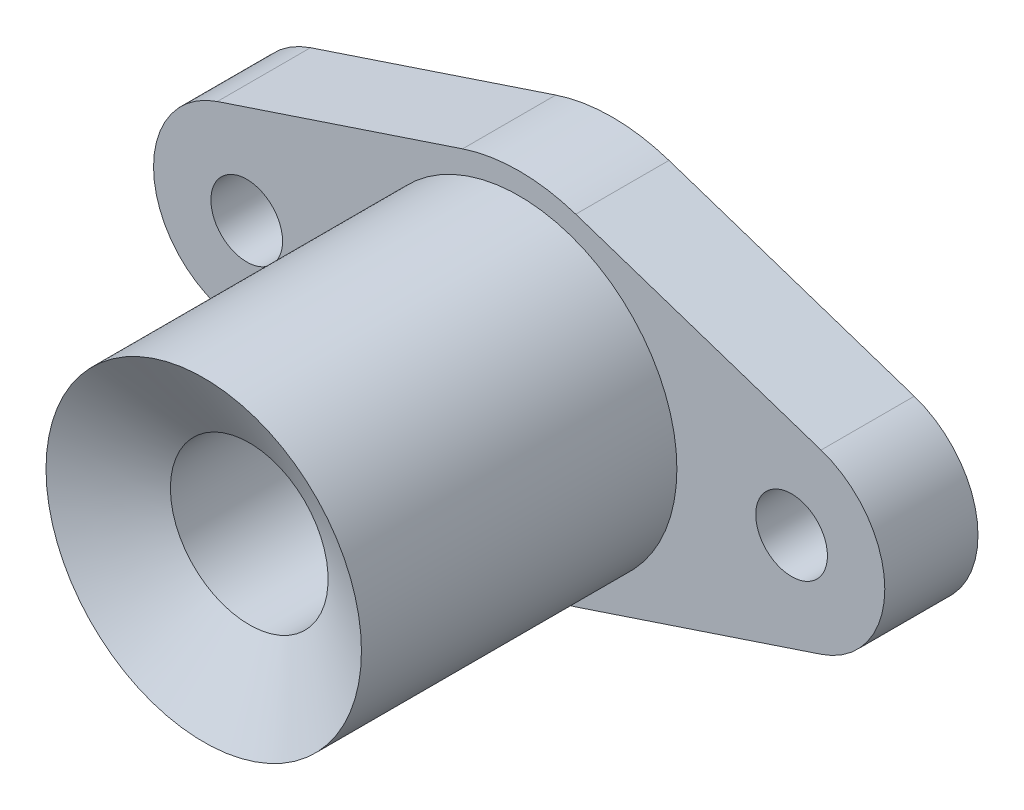
ISO-10303-21;
HEADER;
FILE_DESCRIPTION(('STEP AP214'),'2;1');
FILE_NAME('part.step','',(''),(''),'','','');
FILE_SCHEMA(('AUTOMOTIVE_DESIGN { 1 0 10303 214 1 1 1 1 }'));
ENDSEC;
DATA;
#1=APPLICATION_CONTEXT('core data for automotive mechanical design processes');
#2=APPLICATION_PROTOCOL_DEFINITION('international standard','automotive_design',2000,#1);
#3=PRODUCT_CONTEXT('',#1,'mechanical');
#4=PRODUCT('Part','Part','',(#3));
#5=PRODUCT_RELATED_PRODUCT_CATEGORY('part','',(#4));
#6=PRODUCT_DEFINITION_FORMATION('','',#4);
#7=PRODUCT_DEFINITION_CONTEXT('part definition',#1,'design');
#8=PRODUCT_DEFINITION('design','',#6,#7);
#9=PRODUCT_DEFINITION_SHAPE('','',#8);
#10=(LENGTH_UNIT() NAMED_UNIT(*) SI_UNIT(.MILLI.,.METRE.));
#11=(NAMED_UNIT(*) PLANE_ANGLE_UNIT() SI_UNIT($,.RADIAN.));
#12=(NAMED_UNIT(*) SI_UNIT($,.STERADIAN.) SOLID_ANGLE_UNIT());
#13=UNCERTAINTY_MEASURE_WITH_UNIT(LENGTH_MEASURE(1.E-05),#10,'distance_accuracy_value','');
#14=(GEOMETRIC_REPRESENTATION_CONTEXT(3) GLOBAL_UNCERTAINTY_ASSIGNED_CONTEXT((#13)) GLOBAL_UNIT_ASSIGNED_CONTEXT((#10,
#11,#12)) REPRESENTATION_CONTEXT('',''));
#15=CARTESIAN_POINT('',(0.,0.,0.));
#16=DIRECTION('',(0.,0.,1.));
#17=DIRECTION('',(1.,0.,0.));
#18=AXIS2_PLACEMENT_3D('',#15,#16,#17);
#19=CARTESIAN_POINT('',(-38.,0.,-13.));
#20=DIRECTION('',(0.,0.,1.));
#21=DIRECTION('',(1.,0.,0.));
#22=AXIS2_PLACEMENT_3D('',#19,#20,#21);
#23=CYLINDRICAL_SURFACE('',#22,13.);
#24=CARTESIAN_POINT('',(-38.,0.,0.));
#25=DIRECTION('',(0.,0.,1.));
#26=DIRECTION('',(1.,0.,0.));
#27=AXIS2_PLACEMENT_3D('',#24,#25,#26);
#28=CIRCLE('',#27,13.);
#29=CARTESIAN_POINT('',(-42.1052631578947,12.3347806792189,0.));
#30=VERTEX_POINT('',#29);
#31=CARTESIAN_POINT('',(-42.1052631578947,-12.3347806792189,0.));
#32=VERTEX_POINT('',#31);
#33=EDGE_CURVE('E130',#30,#32,#28,.T.);
#34=ORIENTED_EDGE('',*,*,#33,.F.);
#35=DIRECTION('',(0.,0.,1.));
#36=VECTOR('',#35,1.);
#37=CARTESIAN_POINT('',(-42.1052631578947,12.3347806792189,-13.));
#38=LINE('',#37,#36);
#39=CARTESIAN_POINT('',(-42.1052631578947,12.3347806792189,-13.));
#40=VERTEX_POINT('',#39);
#41=EDGE_CURVE('E11',#40,#30,#38,.T.);
#42=ORIENTED_EDGE('',*,*,#41,.F.);
#43=CARTESIAN_POINT('',(-38.,0.,-13.));
#44=DIRECTION('',(0.,0.,1.));
#45=DIRECTION('',(1.,0.,0.));
#46=AXIS2_PLACEMENT_3D('',#43,#44,#45);
#47=CIRCLE('',#46,13.);
#48=CARTESIAN_POINT('',(-42.1052631578947,-12.3347806792189,-13.));
#49=VERTEX_POINT('',#48);
#50=EDGE_CURVE('E151',#40,#49,#47,.T.);
#51=ORIENTED_EDGE('',*,*,#50,.T.);
#52=DIRECTION('',(0.,0.,1.));
#53=VECTOR('',#52,1.);
#54=CARTESIAN_POINT('',(-42.1052631578947,-12.3347806792189,-13.));
#55=LINE('',#54,#53);
#56=EDGE_CURVE('E36',#49,#32,#55,.T.);
#57=ORIENTED_EDGE('',*,*,#56,.T.);
#58=EDGE_LOOP('',(#34,#42,#51,#57));
#59=FACE_BOUND('',#58,.T.);
#60=ADVANCED_FACE('F33',(#59),#23,.T.);
#61=CARTESIAN_POINT('',(-42.1052631578947,12.3347806792189,-13.));
#62=DIRECTION('',(-0.315789473684211,0.948829283016839,0.));
#63=DIRECTION('',(-0.948829283016839,-0.315789473684211,0.));
#64=AXIS2_PLACEMENT_3D('',#61,#62,#63);
#65=PLANE('',#64);
#66=DIRECTION('',(-0.948829283016839,-0.315789473684211,0.));
#67=VECTOR('',#66,1.);
#68=CARTESIAN_POINT('',(-42.1052631578947,12.3347806792189,0.));
#69=LINE('',#68,#67);
#70=CARTESIAN_POINT('',(-7.89473684210527,23.720732075421,0.));
#71=VERTEX_POINT('',#70);
#72=EDGE_CURVE('E149',#71,#30,#69,.T.);
#73=ORIENTED_EDGE('',*,*,#72,.F.);
#74=DIRECTION('',(0.,0.,1.));
#75=VECTOR('',#74,1.);
#76=CARTESIAN_POINT('',(-7.89473684210527,23.720732075421,-13.));
#77=LINE('',#76,#75);
#78=CARTESIAN_POINT('',(-7.89473684210527,23.720732075421,-13.));
#79=VERTEX_POINT('',#78);
#80=EDGE_CURVE('E42',#79,#71,#77,.T.);
#81=ORIENTED_EDGE('',*,*,#80,.F.);
#82=DIRECTION('',(-0.948829283016839,-0.315789473684211,0.));
#83=VECTOR('',#82,1.);
#84=CARTESIAN_POINT('',(-42.1052631578947,12.3347806792189,-13.));
#85=LINE('',#84,#83);
#86=EDGE_CURVE('E120',#79,#40,#85,.T.);
#87=ORIENTED_EDGE('',*,*,#86,.T.);
#88=ORIENTED_EDGE('',*,*,#41,.T.);
#89=EDGE_LOOP('',(#73,#81,#87,#88));
#90=FACE_BOUND('',#89,.T.);
#91=ADVANCED_FACE('F163',(#90),#65,.T.);
#92=CARTESIAN_POINT('',(0.,0.,-13.));
#93=DIRECTION('',(0.,0.,1.));
#94=DIRECTION('',(1.,0.,0.));
#95=AXIS2_PLACEMENT_3D('',#92,#93,#94);
#96=CYLINDRICAL_SURFACE('',#95,25.);
#97=CARTESIAN_POINT('',(0.,0.,0.));
#98=DIRECTION('',(0.,0.,1.));
#99=DIRECTION('',(1.,0.,0.));
#100=AXIS2_PLACEMENT_3D('',#97,#98,#99);
#101=CIRCLE('',#100,25.);
#102=CARTESIAN_POINT('',(7.89473684210527,23.720732075421,0.));
#103=VERTEX_POINT('',#102);
#104=EDGE_CURVE('E107',#103,#71,#101,.T.);
#105=ORIENTED_EDGE('',*,*,#104,.F.);
#106=DIRECTION('',(0.,0.,1.));
#107=VECTOR('',#106,1.);
#108=CARTESIAN_POINT('',(7.89473684210527,23.720732075421,-13.));
#109=LINE('',#108,#107);
#110=CARTESIAN_POINT('',(7.89473684210527,23.720732075421,-13.));
#111=VERTEX_POINT('',#110);
#112=EDGE_CURVE('E102',#111,#103,#109,.T.);
#113=ORIENTED_EDGE('',*,*,#112,.F.);
#114=CARTESIAN_POINT('',(0.,0.,-13.));
#115=DIRECTION('',(0.,0.,1.));
#116=DIRECTION('',(1.,0.,0.));
#117=AXIS2_PLACEMENT_3D('',#114,#115,#116);
#118=CIRCLE('',#117,25.);
#119=EDGE_CURVE('E105',#111,#79,#118,.T.);
#120=ORIENTED_EDGE('',*,*,#119,.T.);
#121=ORIENTED_EDGE('',*,*,#80,.T.);
#122=EDGE_LOOP('',(#105,#113,#120,#121));
#123=FACE_BOUND('',#122,.T.);
#124=ADVANCED_FACE('F104',(#123),#96,.T.);
#125=CARTESIAN_POINT('',(42.1052631578947,12.3347806792189,-13.));
#126=DIRECTION('',(0.315789473684211,0.948829283016839,0.));
#127=DIRECTION('',(-0.948829283016839,0.315789473684211,0.));
#128=AXIS2_PLACEMENT_3D('',#125,#126,#127);
#129=PLANE('',#128);
#130=DIRECTION('',(-0.948829283016839,0.315789473684211,0.));
#131=VECTOR('',#130,1.);
#132=CARTESIAN_POINT('',(42.1052631578947,12.3347806792189,0.));
#133=LINE('',#132,#131);
#134=CARTESIAN_POINT('',(42.1052631578947,12.3347806792189,0.));
#135=VERTEX_POINT('',#134);
#136=EDGE_CURVE('E146',#135,#103,#133,.T.);
#137=ORIENTED_EDGE('',*,*,#136,.F.);
#138=DIRECTION('',(0.,0.,1.));
#139=VECTOR('',#138,1.);
#140=CARTESIAN_POINT('',(42.1052631578947,12.3347806792189,-13.));
#141=LINE('',#140,#139);
#142=CARTESIAN_POINT('',(42.1052631578947,12.3347806792189,-13.));
#143=VERTEX_POINT('',#142);
#144=EDGE_CURVE('E112',#143,#135,#141,.T.);
#145=ORIENTED_EDGE('',*,*,#144,.F.);
#146=DIRECTION('',(-0.948829283016839,0.315789473684211,0.));
#147=VECTOR('',#146,1.);
#148=CARTESIAN_POINT('',(42.1052631578947,12.3347806792189,-13.));
#149=LINE('',#148,#147);
#150=EDGE_CURVE('E118',#143,#111,#149,.T.);
#151=ORIENTED_EDGE('',*,*,#150,.T.);
#152=ORIENTED_EDGE('',*,*,#112,.T.);
#153=EDGE_LOOP('',(#137,#145,#151,#152));
#154=FACE_BOUND('',#153,.T.);
#155=ADVANCED_FACE('F122',(#154),#129,.T.);
#156=CARTESIAN_POINT('',(38.,0.,-13.));
#157=DIRECTION('',(0.,0.,1.));
#158=DIRECTION('',(1.,0.,0.));
#159=AXIS2_PLACEMENT_3D('',#156,#157,#158);
#160=CYLINDRICAL_SURFACE('',#159,13.);
#161=CARTESIAN_POINT('',(38.,0.,0.));
#162=DIRECTION('',(0.,0.,1.));
#163=DIRECTION('',(-1.,0.,0.));
#164=AXIS2_PLACEMENT_3D('',#161,#162,#163);
#165=CIRCLE('',#164,13.);
#166=CARTESIAN_POINT('',(42.1052631578947,-12.3347806792189,0.));
#167=VERTEX_POINT('',#166);
#168=EDGE_CURVE('E143',#167,#135,#165,.T.);
#169=ORIENTED_EDGE('',*,*,#168,.F.);
#170=DIRECTION('',(0.,0.,1.));
#171=VECTOR('',#170,1.);
#172=CARTESIAN_POINT('',(42.1052631578947,-12.3347806792189,-13.));
#173=LINE('',#172,#171);
#174=CARTESIAN_POINT('',(42.1052631578947,-12.3347806792189,-13.));
#175=VERTEX_POINT('',#174);
#176=EDGE_CURVE('E155',#175,#167,#173,.T.);
#177=ORIENTED_EDGE('',*,*,#176,.F.);
#178=CARTESIAN_POINT('',(38.,0.,-13.));
#179=DIRECTION('',(0.,0.,1.));
#180=DIRECTION('',(-1.,0.,0.));
#181=AXIS2_PLACEMENT_3D('',#178,#179,#180);
#182=CIRCLE('',#181,13.);
#183=EDGE_CURVE('E123',#175,#143,#182,.T.);
#184=ORIENTED_EDGE('',*,*,#183,.T.);
#185=ORIENTED_EDGE('',*,*,#144,.T.);
#186=EDGE_LOOP('',(#169,#177,#184,#185));
#187=FACE_BOUND('',#186,.T.);
#188=ADVANCED_FACE('F176',(#187),#160,.T.);
#189=CARTESIAN_POINT('',(42.1052631578947,-12.3347806792189,-13.));
#190=DIRECTION('',(0.315789473684211,-0.948829283016839,0.));
#191=DIRECTION('',(0.948829283016839,0.315789473684211,0.));
#192=AXIS2_PLACEMENT_3D('',#189,#190,#191);
#193=PLANE('',#192);
#194=DIRECTION('',(0.948829283016839,0.315789473684211,0.));
#195=VECTOR('',#194,1.);
#196=CARTESIAN_POINT('',(42.1052631578947,-12.3347806792189,0.));
#197=LINE('',#196,#195);
#198=CARTESIAN_POINT('',(7.89473684210527,-23.720732075421,0.));
#199=VERTEX_POINT('',#198);
#200=EDGE_CURVE('E140',#199,#167,#197,.T.);
#201=ORIENTED_EDGE('',*,*,#200,.F.);
#202=DIRECTION('',(0.,0.,1.));
#203=VECTOR('',#202,1.);
#204=CARTESIAN_POINT('',(7.89473684210527,-23.720732075421,-13.));
#205=LINE('',#204,#203);
#206=CARTESIAN_POINT('',(7.89473684210527,-23.720732075421,-13.));
#207=VERTEX_POINT('',#206);
#208=EDGE_CURVE('E157',#207,#199,#205,.T.);
#209=ORIENTED_EDGE('',*,*,#208,.F.);
#210=DIRECTION('',(0.948829283016839,0.315789473684211,0.));
#211=VECTOR('',#210,1.);
#212=CARTESIAN_POINT('',(42.1052631578947,-12.3347806792189,-13.));
#213=LINE('',#212,#211);
#214=EDGE_CURVE('E125',#207,#175,#213,.T.);
#215=ORIENTED_EDGE('',*,*,#214,.T.);
#216=ORIENTED_EDGE('',*,*,#176,.T.);
#217=EDGE_LOOP('',(#201,#209,#215,#216));
#218=FACE_BOUND('',#217,.T.);
#219=ADVANCED_FACE('F179',(#218),#193,.T.);
#220=CARTESIAN_POINT('',(0.,0.,-13.));
#221=DIRECTION('',(0.,0.,1.));
#222=DIRECTION('',(1.,0.,0.));
#223=AXIS2_PLACEMENT_3D('',#220,#221,#222);
#224=CYLINDRICAL_SURFACE('',#223,25.);
#225=CARTESIAN_POINT('',(0.,0.,0.));
#226=DIRECTION('',(0.,0.,1.));
#227=DIRECTION('',(1.,0.,0.));
#228=AXIS2_PLACEMENT_3D('',#225,#226,#227);
#229=CIRCLE('',#228,25.);
#230=CARTESIAN_POINT('',(-7.89473684210527,-23.720732075421,0.));
#231=VERTEX_POINT('',#230);
#232=EDGE_CURVE('E137',#231,#199,#229,.T.);
#233=ORIENTED_EDGE('',*,*,#232,.F.);
#234=DIRECTION('',(0.,0.,1.));
#235=VECTOR('',#234,1.);
#236=CARTESIAN_POINT('',(-7.89473684210527,-23.720732075421,-13.));
#237=LINE('',#236,#235);
#238=CARTESIAN_POINT('',(-7.89473684210527,-23.720732075421,-13.));
#239=VERTEX_POINT('',#238);
#240=EDGE_CURVE('E158',#239,#231,#237,.T.);
#241=ORIENTED_EDGE('',*,*,#240,.F.);
#242=CARTESIAN_POINT('',(0.,0.,-13.));
#243=DIRECTION('',(0.,0.,1.));
#244=DIRECTION('',(1.,0.,0.));
#245=AXIS2_PLACEMENT_3D('',#242,#243,#244);
#246=CIRCLE('',#245,25.);
#247=EDGE_CURVE('E250',#239,#207,#246,.T.);
#248=ORIENTED_EDGE('',*,*,#247,.T.);
#249=ORIENTED_EDGE('',*,*,#208,.T.);
#250=EDGE_LOOP('',(#233,#241,#248,#249));
#251=FACE_BOUND('',#250,.T.);
#252=ADVANCED_FACE('F183',(#251),#224,.T.);
#253=CARTESIAN_POINT('',(-42.1052631578947,-12.3347806792189,-13.));
#254=DIRECTION('',(-0.315789473684211,-0.948829283016839,0.));
#255=DIRECTION('',(0.948829283016839,-0.315789473684211,0.));
#256=AXIS2_PLACEMENT_3D('',#253,#254,#255);
#257=PLANE('',#256);
#258=DIRECTION('',(0.948829283016839,-0.315789473684211,0.));
#259=VECTOR('',#258,1.);
#260=CARTESIAN_POINT('',(-42.1052631578947,-12.3347806792189,0.));
#261=LINE('',#260,#259);
#262=EDGE_CURVE('E133',#32,#231,#261,.T.);
#263=ORIENTED_EDGE('',*,*,#262,.F.);
#264=ORIENTED_EDGE('',*,*,#56,.F.);
#265=DIRECTION('',(0.948829283016839,-0.315789473684211,0.));
#266=VECTOR('',#265,1.);
#267=CARTESIAN_POINT('',(-42.1052631578947,-12.3347806792189,-13.));
#268=LINE('',#267,#266);
#269=EDGE_CURVE('E248',#49,#239,#268,.T.);
#270=ORIENTED_EDGE('',*,*,#269,.T.);
#271=ORIENTED_EDGE('',*,*,#240,.T.);
#272=EDGE_LOOP('',(#263,#264,#270,#271));
#273=FACE_BOUND('',#272,.T.);
#274=ADVANCED_FACE('F160',(#273),#257,.T.);
#275=CARTESIAN_POINT('',(-38.,0.,-13.));
#276=DIRECTION('',(0.,0.,1.));
#277=DIRECTION('',(1.,0.,0.));
#278=AXIS2_PLACEMENT_3D('',#275,#276,#277);
#279=PLANE('',#278);
#280=CARTESIAN_POINT('',(0.,0.,-13.));
#281=DIRECTION('',(0.,0.,-1.));
#282=DIRECTION('',(-1.,0.,0.));
#283=AXIS2_PLACEMENT_3D('',#280,#281,#282);
#284=CIRCLE('',#283,11.);
#285=CARTESIAN_POINT('',(-11.,0.,-13.));
#286=VERTEX_POINT('',#285);
#287=EDGE_CURVE('E227',#286,#286,#284,.T.);
#288=ORIENTED_EDGE('',*,*,#287,.F.);
#289=EDGE_LOOP('',(#288));
#290=FACE_BOUND('',#289,.T.);
#291=CARTESIAN_POINT('',(-38.,0.,-13.));
#292=DIRECTION('',(0.,0.,1.));
#293=DIRECTION('',(1.,0.,0.));
#294=AXIS2_PLACEMENT_3D('',#291,#292,#293);
#295=CIRCLE('',#294,5.);
#296=CARTESIAN_POINT('',(-33.,0.,-13.));
#297=VERTEX_POINT('',#296);
#298=EDGE_CURVE('E237',#297,#297,#295,.T.);
#299=ORIENTED_EDGE('',*,*,#298,.T.);
#300=EDGE_LOOP('',(#299));
#301=FACE_BOUND('',#300,.T.);
#302=CARTESIAN_POINT('',(38.,0.,-13.));
#303=DIRECTION('',(0.,0.,1.));
#304=DIRECTION('',(1.,0.,0.));
#305=AXIS2_PLACEMENT_3D('',#302,#303,#304);
#306=CIRCLE('',#305,5.);
#307=CARTESIAN_POINT('',(43.,0.,-13.));
#308=VERTEX_POINT('',#307);
#309=EDGE_CURVE('E134',#308,#308,#306,.T.);
#310=ORIENTED_EDGE('',*,*,#309,.T.);
#311=EDGE_LOOP('',(#310));
#312=FACE_BOUND('',#311,.T.);
#313=ORIENTED_EDGE('',*,*,#50,.F.);
#314=ORIENTED_EDGE('',*,*,#86,.F.);
#315=ORIENTED_EDGE('',*,*,#119,.F.);
#316=ORIENTED_EDGE('',*,*,#150,.F.);
#317=ORIENTED_EDGE('',*,*,#183,.F.);
#318=ORIENTED_EDGE('',*,*,#214,.F.);
#319=ORIENTED_EDGE('',*,*,#247,.F.);
#320=ORIENTED_EDGE('',*,*,#269,.F.);
#321=EDGE_LOOP('',(#313,#314,#315,#316,#317,#318,#319,#320));
#322=FACE_BOUND('',#321,.T.);
#323=ADVANCED_FACE('F116',(#290,#301,#312,#322),#279,.F.);
#324=CARTESIAN_POINT('',(-38.,0.,0.));
#325=DIRECTION('',(0.,0.,1.));
#326=DIRECTION('',(1.,0.,0.));
#327=AXIS2_PLACEMENT_3D('',#324,#325,#326);
#328=PLANE('',#327);
#329=CARTESIAN_POINT('',(0.,0.,0.));
#330=DIRECTION('',(0.,0.,1.));
#331=DIRECTION('',(1.,0.,0.));
#332=AXIS2_PLACEMENT_3D('',#329,#330,#331);
#333=CIRCLE('',#332,22.);
#334=CARTESIAN_POINT('',(22.,0.,0.));
#335=VERTEX_POINT('',#334);
#336=EDGE_CURVE('E230',#335,#335,#333,.T.);
#337=ORIENTED_EDGE('',*,*,#336,.F.);
#338=EDGE_LOOP('',(#337));
#339=FACE_BOUND('',#338,.T.);
#340=CARTESIAN_POINT('',(-38.,0.,0.));
#341=DIRECTION('',(0.,0.,1.));
#342=DIRECTION('',(1.,0.,0.));
#343=AXIS2_PLACEMENT_3D('',#340,#341,#342);
#344=CIRCLE('',#343,5.);
#345=CARTESIAN_POINT('',(-33.,0.,0.));
#346=VERTEX_POINT('',#345);
#347=EDGE_CURVE('E236',#346,#346,#344,.T.);
#348=ORIENTED_EDGE('',*,*,#347,.F.);
#349=EDGE_LOOP('',(#348));
#350=FACE_BOUND('',#349,.T.);
#351=CARTESIAN_POINT('',(38.,0.,0.));
#352=DIRECTION('',(0.,0.,1.));
#353=DIRECTION('',(1.,0.,0.));
#354=AXIS2_PLACEMENT_3D('',#351,#352,#353);
#355=CIRCLE('',#354,5.);
#356=CARTESIAN_POINT('',(43.,0.,0.));
#357=VERTEX_POINT('',#356);
#358=EDGE_CURVE('E240',#357,#357,#355,.T.);
#359=ORIENTED_EDGE('',*,*,#358,.F.);
#360=EDGE_LOOP('',(#359));
#361=FACE_BOUND('',#360,.T.);
#362=ORIENTED_EDGE('',*,*,#33,.T.);
#363=ORIENTED_EDGE('',*,*,#262,.T.);
#364=ORIENTED_EDGE('',*,*,#232,.T.);
#365=ORIENTED_EDGE('',*,*,#200,.T.);
#366=ORIENTED_EDGE('',*,*,#168,.T.);
#367=ORIENTED_EDGE('',*,*,#136,.T.);
#368=ORIENTED_EDGE('',*,*,#104,.T.);
#369=ORIENTED_EDGE('',*,*,#72,.T.);
#370=EDGE_LOOP('',(#362,#363,#364,#365,#366,#367,#368,#369));
#371=FACE_BOUND('',#370,.T.);
#372=ADVANCED_FACE('F162',(#339,#350,#361,#371),#328,.T.);
#373=CARTESIAN_POINT('',(38.,0.,-13.));
#374=DIRECTION('',(0.,0.,1.));
#375=DIRECTION('',(1.,0.,0.));
#376=AXIS2_PLACEMENT_3D('',#373,#374,#375);
#377=CYLINDRICAL_SURFACE('',#376,5.);
#378=CARTESIAN_POINT('',(43.,0.,-13.));
#379=CARTESIAN_POINT('',(43.,0.,-12.8645833333333));
#380=CARTESIAN_POINT('',(43.,0.,-12.7291666666667));
#381=CARTESIAN_POINT('',(43.,0.,-12.4583333333333));
#382=CARTESIAN_POINT('',(43.,0.,-12.3229166666667));
#383=CARTESIAN_POINT('',(43.,0.,-12.0520833333333));
#384=CARTESIAN_POINT('',(43.,0.,-11.9166666666667));
#385=CARTESIAN_POINT('',(43.,0.,-11.6458333333333));
#386=CARTESIAN_POINT('',(43.,0.,-11.5104166666667));
#387=CARTESIAN_POINT('',(43.,0.,-11.2395833333333));
#388=CARTESIAN_POINT('',(43.,0.,-11.1041666666667));
#389=CARTESIAN_POINT('',(43.,0.,-10.8333333333333));
#390=CARTESIAN_POINT('',(43.,0.,-10.6979166666667));
#391=CARTESIAN_POINT('',(43.,0.,-10.4270833333333));
#392=CARTESIAN_POINT('',(43.,0.,-10.2916666666667));
#393=CARTESIAN_POINT('',(43.,0.,-10.0208333333333));
#394=CARTESIAN_POINT('',(43.,0.,-9.88541666666667));
#395=CARTESIAN_POINT('',(43.,0.,-9.61458333333333));
#396=CARTESIAN_POINT('',(43.,0.,-9.47916666666667));
#397=CARTESIAN_POINT('',(43.,0.,-9.20833333333333));
#398=CARTESIAN_POINT('',(43.,0.,-9.07291666666667));
#399=CARTESIAN_POINT('',(43.,0.,-8.80208333333333));
#400=CARTESIAN_POINT('',(43.,0.,-8.66666666666667));
#401=CARTESIAN_POINT('',(43.,0.,-8.39583333333333));
#402=CARTESIAN_POINT('',(43.,0.,-8.26041666666667));
#403=CARTESIAN_POINT('',(43.,0.,-7.98958333333333));
#404=CARTESIAN_POINT('',(43.,0.,-7.85416666666667));
#405=CARTESIAN_POINT('',(43.,0.,-7.58333333333333));
#406=CARTESIAN_POINT('',(43.,0.,-7.44791666666667));
#407=CARTESIAN_POINT('',(43.,0.,-7.17708333333333));
#408=CARTESIAN_POINT('',(43.,0.,-7.04166666666667));
#409=CARTESIAN_POINT('',(43.,0.,-6.77083333333333));
#410=CARTESIAN_POINT('',(43.,0.,-6.63541666666667));
#411=CARTESIAN_POINT('',(43.,0.,-6.36458333333333));
#412=CARTESIAN_POINT('',(43.,0.,-6.22916666666667));
#413=CARTESIAN_POINT('',(43.,0.,-5.95833333333333));
#414=CARTESIAN_POINT('',(43.,0.,-5.82291666666667));
#415=CARTESIAN_POINT('',(43.,0.,-5.55208333333333));
#416=CARTESIAN_POINT('',(43.,0.,-5.41666666666667));
#417=CARTESIAN_POINT('',(43.,0.,-5.14583333333333));
#418=CARTESIAN_POINT('',(43.,0.,-5.01041666666667));
#419=CARTESIAN_POINT('',(43.,0.,-4.73958333333333));
#420=CARTESIAN_POINT('',(43.,0.,-4.60416666666667));
#421=CARTESIAN_POINT('',(43.,0.,-4.33333333333333));
#422=CARTESIAN_POINT('',(43.,0.,-4.19791666666667));
#423=CARTESIAN_POINT('',(43.,0.,-3.92708333333333));
#424=CARTESIAN_POINT('',(43.,0.,-3.79166666666667));
#425=CARTESIAN_POINT('',(43.,0.,-3.52083333333333));
#426=CARTESIAN_POINT('',(43.,0.,-3.38541666666667));
#427=CARTESIAN_POINT('',(43.,0.,-3.11458333333333));
#428=CARTESIAN_POINT('',(43.,0.,-2.97916666666667));
#429=CARTESIAN_POINT('',(43.,0.,-2.70833333333333));
#430=CARTESIAN_POINT('',(43.,0.,-2.57291666666667));
#431=CARTESIAN_POINT('',(43.,0.,-2.30208333333333));
#432=CARTESIAN_POINT('',(43.,0.,-2.16666666666667));
#433=CARTESIAN_POINT('',(43.,0.,-1.89583333333333));
#434=CARTESIAN_POINT('',(43.,0.,-1.76041666666667));
#435=CARTESIAN_POINT('',(43.,0.,-1.48958333333333));
#436=CARTESIAN_POINT('',(43.,0.,-1.35416666666667));
#437=CARTESIAN_POINT('',(43.,0.,-1.08333333333333));
#438=CARTESIAN_POINT('',(43.,0.,-0.947916666666667));
#439=CARTESIAN_POINT('',(43.,0.,-0.677083333333334));
#440=CARTESIAN_POINT('',(43.,0.,-0.541666666666667));
#441=CARTESIAN_POINT('',(43.,0.,-0.270833333333334));
#442=CARTESIAN_POINT('',(43.,0.,-0.135416666666667));
#443=CARTESIAN_POINT('',(43.,0.,0.));
#444=B_SPLINE_CURVE_WITH_KNOTS('',3,(#378,#379,#380,#381,#382,#383,#384,#385,#386,#387,#388,
#389,#390,#391,#392,#393,#394,#395,#396,#397,#398,#399,#400,#401,#402,#403,#404,#405,#406,#407,
#408,#409,#410,#411,#412,#413,#414,#415,#416,#417,#418,#419,#420,#421,#422,#423,#424,#425,#426,
#427,#428,#429,#430,#431,#432,#433,#434,#435,#436,#437,#438,#439,#440,#441,#442,#443),
.UNSPECIFIED.,.F.,.F.,(4,2,2,2,2,2,2,2,2,2,2,2,2,2,2,2,2,2,2,2,2,2,2,2,2,2,2,2,2,2,2,2,4),(0.,
0.406249999999999,0.812499999999999,1.21875,1.625,2.03125,2.4375,2.84375,3.25,3.65625,4.0625,
4.46875,4.875,5.28125,5.6875,6.09375,6.5,6.90625,7.3125,7.71875,8.125,8.53125,8.9375,9.34375,
9.75,10.15625,10.5625,10.96875,11.375,11.78125,12.1875,12.59375,13.),.UNSPECIFIED.);
#445=EDGE_CURVE('BSEAM195',#308,#357,#444,.T.);
#446=ORIENTED_EDGE('',*,*,#309,.F.);
#447=ORIENTED_EDGE('',*,*,#358,.T.);
#448=ORIENTED_EDGE('',*,*,#445,.T.);
#449=ORIENTED_EDGE('',*,*,#445,.F.);
#450=EDGE_LOOP('',(#446,#448,#447,#449));
#451=FACE_BOUND('',#450,.T.);
#452=ADVANCED_FACE('F195',(#451),#377,.F.);
#453=CARTESIAN_POINT('',(-38.,0.,-13.));
#454=DIRECTION('',(0.,0.,1.));
#455=DIRECTION('',(1.,0.,0.));
#456=AXIS2_PLACEMENT_3D('',#453,#454,#455);
#457=CYLINDRICAL_SURFACE('',#456,5.);
#458=CARTESIAN_POINT('',(-33.,0.,-13.));
#459=CARTESIAN_POINT('',(-33.,0.,-12.8645833333333));
#460=CARTESIAN_POINT('',(-33.,0.,-12.7291666666667));
#461=CARTESIAN_POINT('',(-33.,0.,-12.4583333333333));
#462=CARTESIAN_POINT('',(-33.,0.,-12.3229166666667));
#463=CARTESIAN_POINT('',(-33.,0.,-12.0520833333333));
#464=CARTESIAN_POINT('',(-33.,0.,-11.9166666666667));
#465=CARTESIAN_POINT('',(-33.,0.,-11.6458333333333));
#466=CARTESIAN_POINT('',(-33.,0.,-11.5104166666667));
#467=CARTESIAN_POINT('',(-33.,0.,-11.2395833333333));
#468=CARTESIAN_POINT('',(-33.,0.,-11.1041666666667));
#469=CARTESIAN_POINT('',(-33.,0.,-10.8333333333333));
#470=CARTESIAN_POINT('',(-33.,0.,-10.6979166666667));
#471=CARTESIAN_POINT('',(-33.,0.,-10.4270833333333));
#472=CARTESIAN_POINT('',(-33.,0.,-10.2916666666667));
#473=CARTESIAN_POINT('',(-33.,0.,-10.0208333333333));
#474=CARTESIAN_POINT('',(-33.,0.,-9.88541666666667));
#475=CARTESIAN_POINT('',(-33.,0.,-9.61458333333333));
#476=CARTESIAN_POINT('',(-33.,0.,-9.47916666666667));
#477=CARTESIAN_POINT('',(-33.,0.,-9.20833333333333));
#478=CARTESIAN_POINT('',(-33.,0.,-9.07291666666667));
#479=CARTESIAN_POINT('',(-33.,0.,-8.80208333333333));
#480=CARTESIAN_POINT('',(-33.,0.,-8.66666666666667));
#481=CARTESIAN_POINT('',(-33.,0.,-8.39583333333333));
#482=CARTESIAN_POINT('',(-33.,0.,-8.26041666666667));
#483=CARTESIAN_POINT('',(-33.,0.,-7.98958333333333));
#484=CARTESIAN_POINT('',(-33.,0.,-7.85416666666667));
#485=CARTESIAN_POINT('',(-33.,0.,-7.58333333333333));
#486=CARTESIAN_POINT('',(-33.,0.,-7.44791666666667));
#487=CARTESIAN_POINT('',(-33.,0.,-7.17708333333333));
#488=CARTESIAN_POINT('',(-33.,0.,-7.04166666666667));
#489=CARTESIAN_POINT('',(-33.,0.,-6.77083333333333));
#490=CARTESIAN_POINT('',(-33.,0.,-6.63541666666667));
#491=CARTESIAN_POINT('',(-33.,0.,-6.36458333333333));
#492=CARTESIAN_POINT('',(-33.,0.,-6.22916666666667));
#493=CARTESIAN_POINT('',(-33.,0.,-5.95833333333333));
#494=CARTESIAN_POINT('',(-33.,0.,-5.82291666666667));
#495=CARTESIAN_POINT('',(-33.,0.,-5.55208333333333));
#496=CARTESIAN_POINT('',(-33.,0.,-5.41666666666667));
#497=CARTESIAN_POINT('',(-33.,0.,-5.14583333333333));
#498=CARTESIAN_POINT('',(-33.,0.,-5.01041666666667));
#499=CARTESIAN_POINT('',(-33.,0.,-4.73958333333333));
#500=CARTESIAN_POINT('',(-33.,0.,-4.60416666666667));
#501=CARTESIAN_POINT('',(-33.,0.,-4.33333333333333));
#502=CARTESIAN_POINT('',(-33.,0.,-4.19791666666667));
#503=CARTESIAN_POINT('',(-33.,0.,-3.92708333333333));
#504=CARTESIAN_POINT('',(-33.,0.,-3.79166666666667));
#505=CARTESIAN_POINT('',(-33.,0.,-3.52083333333333));
#506=CARTESIAN_POINT('',(-33.,0.,-3.38541666666667));
#507=CARTESIAN_POINT('',(-33.,0.,-3.11458333333333));
#508=CARTESIAN_POINT('',(-33.,0.,-2.97916666666667));
#509=CARTESIAN_POINT('',(-33.,0.,-2.70833333333333));
#510=CARTESIAN_POINT('',(-33.,0.,-2.57291666666667));
#511=CARTESIAN_POINT('',(-33.,0.,-2.30208333333333));
#512=CARTESIAN_POINT('',(-33.,0.,-2.16666666666667));
#513=CARTESIAN_POINT('',(-33.,0.,-1.89583333333333));
#514=CARTESIAN_POINT('',(-33.,0.,-1.76041666666667));
#515=CARTESIAN_POINT('',(-33.,0.,-1.48958333333333));
#516=CARTESIAN_POINT('',(-33.,0.,-1.35416666666667));
#517=CARTESIAN_POINT('',(-33.,0.,-1.08333333333333));
#518=CARTESIAN_POINT('',(-33.,0.,-0.947916666666667));
#519=CARTESIAN_POINT('',(-33.,0.,-0.677083333333334));
#520=CARTESIAN_POINT('',(-33.,0.,-0.541666666666667));
#521=CARTESIAN_POINT('',(-33.,0.,-0.270833333333334));
#522=CARTESIAN_POINT('',(-33.,0.,-0.135416666666667));
#523=CARTESIAN_POINT('',(-33.,0.,0.));
#524=B_SPLINE_CURVE_WITH_KNOTS('',3,(#458,#459,#460,#461,#462,#463,#464,#465,#466,#467,#468,
#469,#470,#471,#472,#473,#474,#475,#476,#477,#478,#479,#480,#481,#482,#483,#484,#485,#486,#487,
#488,#489,#490,#491,#492,#493,#494,#495,#496,#497,#498,#499,#500,#501,#502,#503,#504,#505,#506,
#507,#508,#509,#510,#511,#512,#513,#514,#515,#516,#517,#518,#519,#520,#521,#522,#523),
.UNSPECIFIED.,.F.,.F.,(4,2,2,2,2,2,2,2,2,2,2,2,2,2,2,2,2,2,2,2,2,2,2,2,2,2,2,2,2,2,2,2,4),(0.,
0.406249999999999,0.812499999999999,1.21875,1.625,2.03125,2.4375,2.84375,3.25,3.65625,4.0625,
4.46875,4.875,5.28125,5.6875,6.09375,6.5,6.90625,7.3125,7.71875,8.125,8.53125,8.9375,9.34375,
9.75,10.15625,10.5625,10.96875,11.375,11.78125,12.1875,12.59375,13.),.UNSPECIFIED.);
#525=EDGE_CURVE('BSEAM202',#297,#346,#524,.T.);
#526=ORIENTED_EDGE('',*,*,#298,.F.);
#527=ORIENTED_EDGE('',*,*,#347,.T.);
#528=ORIENTED_EDGE('',*,*,#525,.T.);
#529=ORIENTED_EDGE('',*,*,#525,.F.);
#530=EDGE_LOOP('',(#526,#528,#527,#529));
#531=FACE_BOUND('',#530,.T.);
#532=ADVANCED_FACE('F202',(#531),#457,.F.);
#533=CARTESIAN_POINT('',(0.,0.,44.));
#534=DIRECTION('',(0.,0.,-1.));
#535=DIRECTION('',(-1.,0.,0.));
#536=AXIS2_PLACEMENT_3D('',#533,#534,#535);
#537=CYLINDRICAL_SURFACE('',#536,22.);
#538=CARTESIAN_POINT('',(0.,0.,44.));
#539=DIRECTION('',(0.,0.,-1.));
#540=DIRECTION('',(-1.,0.,0.));
#541=AXIS2_PLACEMENT_3D('',#538,#539,#540);
#542=CIRCLE('',#541,22.);
#543=CARTESIAN_POINT('',(-22.,0.,44.));
#544=VERTEX_POINT('',#543);
#545=EDGE_CURVE('E223',#544,#544,#542,.T.);
#546=ORIENTED_EDGE('',*,*,#545,.T.);
#547=EDGE_LOOP('',(#546));
#548=FACE_BOUND('',#547,.T.);
#549=ORIENTED_EDGE('',*,*,#336,.T.);
#550=EDGE_LOOP('',(#549));
#551=FACE_BOUND('',#550,.T.);
#552=ADVANCED_FACE('F206',(#548,#551),#537,.T.);
#553=CARTESIAN_POINT('',(0.,0.,-13.));
#554=DIRECTION('',(0.,0.,-1.));
#555=DIRECTION('',(-1.,0.,0.));
#556=AXIS2_PLACEMENT_3D('',#553,#554,#555);
#557=CYLINDRICAL_SURFACE('',#556,11.);
#558=CARTESIAN_POINT('',(0.,0.,37.6491470389142));
#559=DIRECTION('',(0.,0.,-1.));
#560=DIRECTION('',(-1.,0.,0.));
#561=AXIS2_PLACEMENT_3D('',#558,#559,#560);
#562=CIRCLE('',#561,11.);
#563=CARTESIAN_POINT('',(-11.,0.,37.6491470389142));
#564=VERTEX_POINT('',#563);
#565=EDGE_CURVE('E226',#564,#564,#562,.T.);
#566=ORIENTED_EDGE('',*,*,#565,.F.);
#567=EDGE_LOOP('',(#566));
#568=FACE_BOUND('',#567,.T.);
#569=ORIENTED_EDGE('',*,*,#287,.T.);
#570=EDGE_LOOP('',(#569));
#571=FACE_BOUND('',#570,.T.);
#572=ADVANCED_FACE('F210',(#568,#571),#557,.F.);
#573=CARTESIAN_POINT('',(0.,0.,37.6491470389142));
#574=DIRECTION('',(0.,0.,1.));
#575=DIRECTION('',(1.,0.,0.));
#576=AXIS2_PLACEMENT_3D('',#573,#574,#575);
#577=CONICAL_SURFACE('',#576,11.,1.0471975511966);
#578=ORIENTED_EDGE('',*,*,#545,.F.);
#579=EDGE_LOOP('',(#578));
#580=FACE_BOUND('',#579,.T.);
#581=ORIENTED_EDGE('',*,*,#565,.T.);
#582=EDGE_LOOP('',(#581));
#583=FACE_BOUND('',#582,.T.);
#584=ADVANCED_FACE('F214',(#580,#583),#577,.F.);
#585=CLOSED_SHELL('',(#60,#91,#124,#155,#188,#219,#252,#274,#323,#372,#452,#532,#552,#572,#584));
#586=MANIFOLD_SOLID_BREP('B2',#585);
#587=ADVANCED_BREP_SHAPE_REPRESENTATION('',(#18,#586),#14);
#588=SHAPE_DEFINITION_REPRESENTATION(#9,#587);
ENDSEC;
END-ISO-10303-21;
